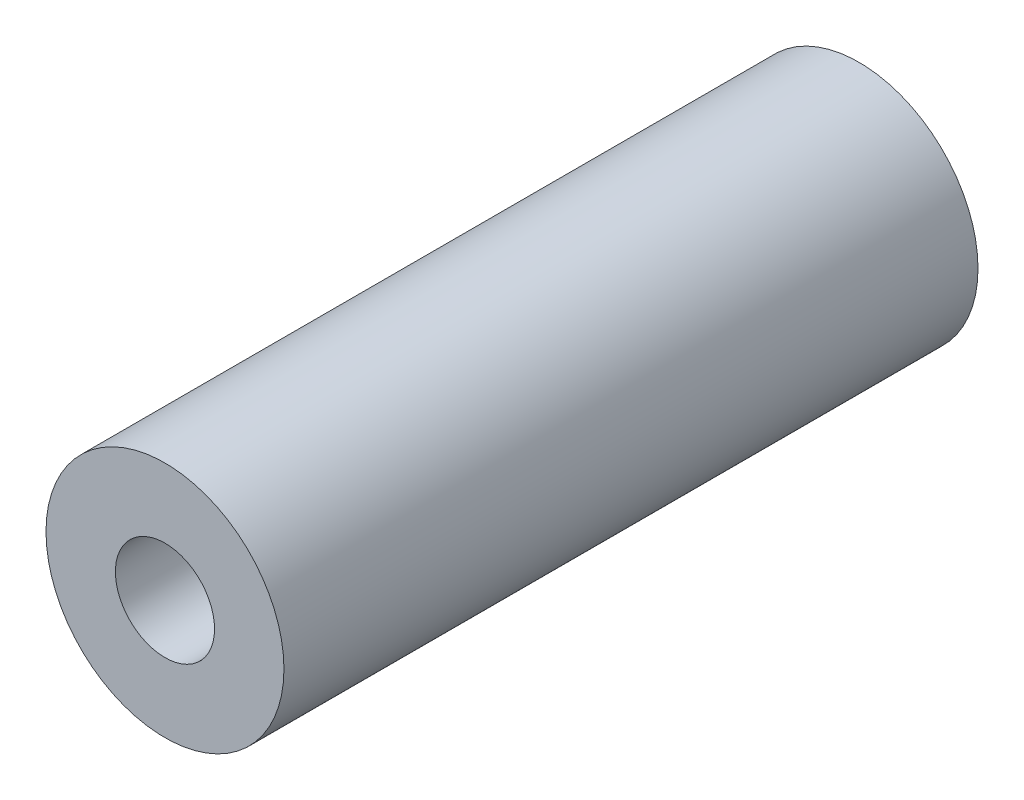
ISO-10303-21;
HEADER;
FILE_DESCRIPTION(('STEP AP214'),'2;1');
FILE_NAME('part.step','',(''),(''),'','','');
FILE_SCHEMA(('AUTOMOTIVE_DESIGN { 1 0 10303 214 1 1 1 1 }'));
ENDSEC;
DATA;
#1=APPLICATION_CONTEXT('core data for automotive mechanical design processes');
#2=APPLICATION_PROTOCOL_DEFINITION('international standard','automotive_design',2000,#1);
#3=PRODUCT_CONTEXT('',#1,'mechanical');
#4=PRODUCT('Part','Part','',(#3));
#5=PRODUCT_RELATED_PRODUCT_CATEGORY('part','',(#4));
#6=PRODUCT_DEFINITION_FORMATION('','',#4);
#7=PRODUCT_DEFINITION_CONTEXT('part definition',#1,'design');
#8=PRODUCT_DEFINITION('design','',#6,#7);
#9=PRODUCT_DEFINITION_SHAPE('','',#8);
#10=(LENGTH_UNIT() NAMED_UNIT(*) SI_UNIT(.MILLI.,.METRE.));
#11=(NAMED_UNIT(*) PLANE_ANGLE_UNIT() SI_UNIT($,.RADIAN.));
#12=(NAMED_UNIT(*) SI_UNIT($,.STERADIAN.) SOLID_ANGLE_UNIT());
#13=UNCERTAINTY_MEASURE_WITH_UNIT(LENGTH_MEASURE(1.E-05),#10,'distance_accuracy_value','');
#14=(GEOMETRIC_REPRESENTATION_CONTEXT(3) GLOBAL_UNCERTAINTY_ASSIGNED_CONTEXT((#13)) GLOBAL_UNIT_ASSIGNED_CONTEXT((#10,
#11,#12)) REPRESENTATION_CONTEXT('',''));
#15=CARTESIAN_POINT('',(0.,0.,0.));
#16=DIRECTION('',(0.,0.,1.));
#17=DIRECTION('',(1.,0.,0.));
#18=AXIS2_PLACEMENT_3D('',#15,#16,#17);
#19=CARTESIAN_POINT('',(0.,0.,70.));
#20=DIRECTION('',(0.,0.,1.));
#21=DIRECTION('',(1.,0.,0.));
#22=AXIS2_PLACEMENT_3D('',#19,#20,#21);
#23=PLANE('',#22);
#24=CARTESIAN_POINT('',(0.,0.,70.));
#25=DIRECTION('',(0.,0.,1.));
#26=DIRECTION('',(1.,0.,0.));
#27=AXIS2_PLACEMENT_3D('',#24,#25,#26);
#28=CIRCLE('',#27,12.);
#29=CARTESIAN_POINT('',(12.,0.,70.));
#30=VERTEX_POINT('',#29);
#31=EDGE_CURVE('E10',#30,#30,#28,.T.);
#32=ORIENTED_EDGE('',*,*,#31,.T.);
#33=EDGE_LOOP('',(#32));
#34=FACE_BOUND('',#33,.T.);
#35=CARTESIAN_POINT('',(0.,0.,70.));
#36=DIRECTION('',(0.,0.,1.));
#37=DIRECTION('',(1.,0.,0.));
#38=AXIS2_PLACEMENT_3D('',#35,#36,#37);
#39=CIRCLE('',#38,5.);
#40=CARTESIAN_POINT('',(5.,0.,70.));
#41=VERTEX_POINT('',#40);
#42=EDGE_CURVE('E39',#41,#41,#39,.T.);
#43=ORIENTED_EDGE('',*,*,#42,.F.);
#44=EDGE_LOOP('',(#43));
#45=FACE_BOUND('',#44,.T.);
#46=ADVANCED_FACE('F28',(#34,#45),#23,.T.);
#47=CARTESIAN_POINT('',(0.,0.,0.));
#48=DIRECTION('',(0.,0.,1.));
#49=DIRECTION('',(1.,0.,0.));
#50=AXIS2_PLACEMENT_3D('',#47,#48,#49);
#51=PLANE('',#50);
#52=CARTESIAN_POINT('',(0.,0.,0.));
#53=DIRECTION('',(0.,0.,1.));
#54=DIRECTION('',(1.,0.,0.));
#55=AXIS2_PLACEMENT_3D('',#52,#53,#54);
#56=CIRCLE('',#55,12.);
#57=CARTESIAN_POINT('',(12.,0.,0.));
#58=VERTEX_POINT('',#57);
#59=EDGE_CURVE('E32',#58,#58,#56,.T.);
#60=ORIENTED_EDGE('',*,*,#59,.F.);
#61=EDGE_LOOP('',(#60));
#62=FACE_BOUND('',#61,.T.);
#63=CARTESIAN_POINT('',(0.,0.,0.));
#64=DIRECTION('',(0.,0.,1.));
#65=DIRECTION('',(1.,0.,0.));
#66=AXIS2_PLACEMENT_3D('',#63,#64,#65);
#67=CIRCLE('',#66,5.);
#68=CARTESIAN_POINT('',(5.,0.,0.));
#69=VERTEX_POINT('',#68);
#70=EDGE_CURVE('E41',#69,#69,#67,.T.);
#71=ORIENTED_EDGE('',*,*,#70,.T.);
#72=EDGE_LOOP('',(#71));
#73=FACE_BOUND('',#72,.T.);
#74=ADVANCED_FACE('F51',(#62,#73),#51,.F.);
#75=CARTESIAN_POINT('',(0.,0.,70.));
#76=DIRECTION('',(0.,0.,-1.));
#77=DIRECTION('',(-1.,0.,0.));
#78=AXIS2_PLACEMENT_3D('',#75,#76,#77);
#79=CYLINDRICAL_SURFACE('',#78,12.);
#80=ORIENTED_EDGE('',*,*,#31,.F.);
#81=EDGE_LOOP('',(#80));
#82=FACE_BOUND('',#81,.T.);
#83=ORIENTED_EDGE('',*,*,#59,.T.);
#84=EDGE_LOOP('',(#83));
#85=FACE_BOUND('',#84,.T.);
#86=ADVANCED_FACE('F30',(#82,#85),#79,.T.);
#87=CARTESIAN_POINT('',(0.,0.,70.));
#88=DIRECTION('',(0.,0.,-1.));
#89=DIRECTION('',(-1.,0.,0.));
#90=AXIS2_PLACEMENT_3D('',#87,#88,#89);
#91=CYLINDRICAL_SURFACE('',#90,5.);
#92=ORIENTED_EDGE('',*,*,#42,.T.);
#93=EDGE_LOOP('',(#92));
#94=FACE_BOUND('',#93,.T.);
#95=ORIENTED_EDGE('',*,*,#70,.F.);
#96=EDGE_LOOP('',(#95));
#97=FACE_BOUND('',#96,.T.);
#98=ADVANCED_FACE('F47',(#94,#97),#91,.F.);
#99=CLOSED_SHELL('',(#46,#74,#86,#98));
#100=MANIFOLD_SOLID_BREP('B2',#99);
#101=ADVANCED_BREP_SHAPE_REPRESENTATION('',(#18,#100),#14);
#102=SHAPE_DEFINITION_REPRESENTATION(#9,#101);
ENDSEC;
END-ISO-10303-21;
